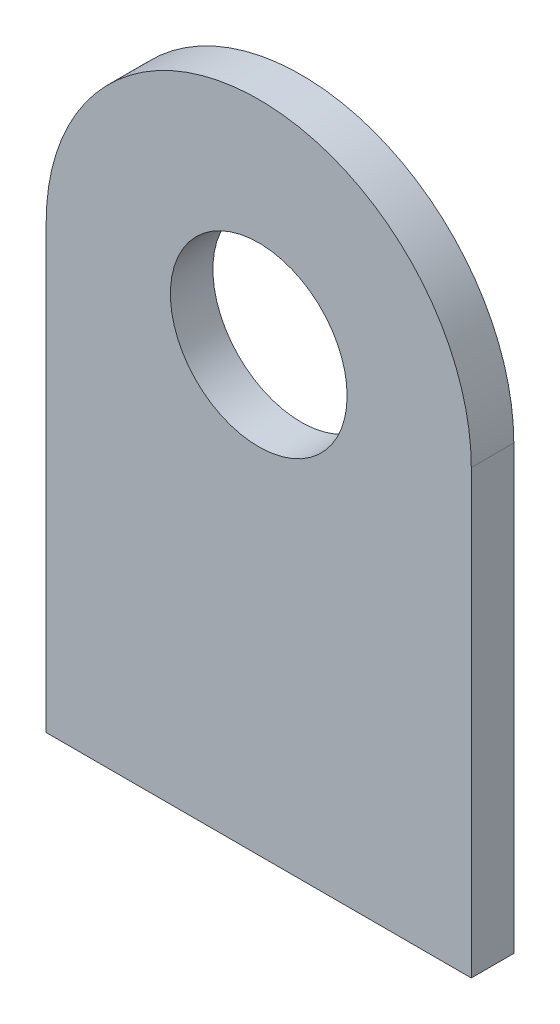
ISO-10303-21;
HEADER;
FILE_DESCRIPTION(('STEP AP214'),'2;1');
FILE_NAME('part.step','',(''),(''),'','','');
FILE_SCHEMA(('AUTOMOTIVE_DESIGN { 1 0 10303 214 1 1 1 1 }'));
ENDSEC;
DATA;
#1=APPLICATION_CONTEXT('core data for automotive mechanical design processes');
#2=APPLICATION_PROTOCOL_DEFINITION('international standard','automotive_design',2000,#1);
#3=PRODUCT_CONTEXT('',#1,'mechanical');
#4=PRODUCT('Part','Part','',(#3));
#5=PRODUCT_RELATED_PRODUCT_CATEGORY('part','',(#4));
#6=PRODUCT_DEFINITION_FORMATION('','',#4);
#7=PRODUCT_DEFINITION_CONTEXT('part definition',#1,'design');
#8=PRODUCT_DEFINITION('design','',#6,#7);
#9=PRODUCT_DEFINITION_SHAPE('','',#8);
#10=(LENGTH_UNIT() NAMED_UNIT(*) SI_UNIT(.MILLI.,.METRE.));
#11=(NAMED_UNIT(*) PLANE_ANGLE_UNIT() SI_UNIT($,.RADIAN.));
#12=(NAMED_UNIT(*) SI_UNIT($,.STERADIAN.) SOLID_ANGLE_UNIT());
#13=UNCERTAINTY_MEASURE_WITH_UNIT(LENGTH_MEASURE(1.E-05),#10,'distance_accuracy_value','');
#14=(GEOMETRIC_REPRESENTATION_CONTEXT(3) GLOBAL_UNCERTAINTY_ASSIGNED_CONTEXT((#13)) GLOBAL_UNIT_ASSIGNED_CONTEXT((#10,
#11,#12)) REPRESENTATION_CONTEXT('',''));
#15=CARTESIAN_POINT('',(0.,0.,0.));
#16=DIRECTION('',(0.,0.,1.));
#17=DIRECTION('',(1.,0.,0.));
#18=AXIS2_PLACEMENT_3D('',#15,#16,#17);
#19=CARTESIAN_POINT('',(0.,0.,1.5875));
#20=DIRECTION('',(0.,0.,-1.));
#21=DIRECTION('',(-1.,0.,0.));
#22=AXIS2_PLACEMENT_3D('',#19,#20,#21);
#23=CYLINDRICAL_SURFACE('',#22,7.9375);
#24=CARTESIAN_POINT('',(0.,0.,0.));
#25=DIRECTION('',(0.,0.,1.));
#26=DIRECTION('',(1.,0.,0.));
#27=AXIS2_PLACEMENT_3D('',#24,#25,#26);
#28=CIRCLE('',#27,7.9375);
#29=CARTESIAN_POINT('',(7.9375,0.,0.));
#30=VERTEX_POINT('',#29);
#31=CARTESIAN_POINT('',(-7.9375,0.,0.));
#32=VERTEX_POINT('',#31);
#33=EDGE_CURVE('E115',#30,#32,#28,.T.);
#34=ORIENTED_EDGE('',*,*,#33,.T.);
#35=DIRECTION('',(0.,0.,-1.));
#36=VECTOR('',#35,1.);
#37=CARTESIAN_POINT('',(-7.9375,0.,1.5875));
#38=LINE('',#37,#36);
#39=CARTESIAN_POINT('',(-7.9375,0.,1.5875));
#40=VERTEX_POINT('',#39);
#41=EDGE_CURVE('E11',#40,#32,#38,.T.);
#42=ORIENTED_EDGE('',*,*,#41,.F.);
#43=CARTESIAN_POINT('',(0.,0.,1.5875));
#44=DIRECTION('',(0.,0.,1.));
#45=DIRECTION('',(1.,0.,0.));
#46=AXIS2_PLACEMENT_3D('',#43,#44,#45);
#47=CIRCLE('',#46,7.9375);
#48=CARTESIAN_POINT('',(7.9375,0.,1.5875));
#49=VERTEX_POINT('',#48);
#50=EDGE_CURVE('E99',#49,#40,#47,.T.);
#51=ORIENTED_EDGE('',*,*,#50,.F.);
#52=DIRECTION('',(0.,0.,-1.));
#53=VECTOR('',#52,1.);
#54=CARTESIAN_POINT('',(7.9375,0.,1.5875));
#55=LINE('',#54,#53);
#56=EDGE_CURVE('E111',#49,#30,#55,.T.);
#57=ORIENTED_EDGE('',*,*,#56,.T.);
#58=EDGE_LOOP('',(#34,#42,#51,#57));
#59=FACE_BOUND('',#58,.T.);
#60=ADVANCED_FACE('F47',(#59),#23,.T.);
#61=CARTESIAN_POINT('',(-7.9375,0.,1.5875));
#62=DIRECTION('',(1.,0.,0.));
#63=DIRECTION('',(0.,1.,0.));
#64=AXIS2_PLACEMENT_3D('',#61,#62,#63);
#65=PLANE('',#64);
#66=DIRECTION('',(0.,-1.,0.));
#67=VECTOR('',#66,1.);
#68=CARTESIAN_POINT('',(-7.9375,0.,0.));
#69=LINE('',#68,#67);
#70=CARTESIAN_POINT('',(-7.9375,-16.51,0.));
#71=VERTEX_POINT('',#70);
#72=EDGE_CURVE('E104',#32,#71,#69,.T.);
#73=ORIENTED_EDGE('',*,*,#72,.T.);
#74=DIRECTION('',(0.,0.,-1.));
#75=VECTOR('',#74,1.);
#76=CARTESIAN_POINT('',(-7.9375,-16.51,1.5875));
#77=LINE('',#76,#75);
#78=CARTESIAN_POINT('',(-7.9375,-16.51,1.5875));
#79=VERTEX_POINT('',#78);
#80=EDGE_CURVE('E56',#79,#71,#77,.T.);
#81=ORIENTED_EDGE('',*,*,#80,.F.);
#82=DIRECTION('',(0.,-1.,0.));
#83=VECTOR('',#82,1.);
#84=CARTESIAN_POINT('',(-7.9375,0.,1.5875));
#85=LINE('',#84,#83);
#86=EDGE_CURVE('E94',#40,#79,#85,.T.);
#87=ORIENTED_EDGE('',*,*,#86,.F.);
#88=ORIENTED_EDGE('',*,*,#41,.T.);
#89=EDGE_LOOP('',(#73,#81,#87,#88));
#90=FACE_BOUND('',#89,.T.);
#91=ADVANCED_FACE('F103',(#90),#65,.F.);
#92=CARTESIAN_POINT('',(0.,-16.51,1.5875));
#93=DIRECTION('',(0.,1.,0.));
#94=DIRECTION('',(0.,0.,1.));
#95=AXIS2_PLACEMENT_3D('',#92,#93,#94);
#96=PLANE('',#95);
#97=DIRECTION('',(1.,0.,0.));
#98=VECTOR('',#97,1.);
#99=CARTESIAN_POINT('',(0.,-16.51,0.));
#100=LINE('',#99,#98);
#101=CARTESIAN_POINT('',(7.9375,-16.51,0.));
#102=VERTEX_POINT('',#101);
#103=EDGE_CURVE('E81',#71,#102,#100,.T.);
#104=ORIENTED_EDGE('',*,*,#103,.T.);
#105=DIRECTION('',(0.,0.,-1.));
#106=VECTOR('',#105,1.);
#107=CARTESIAN_POINT('',(7.9375,-16.51,1.5875));
#108=LINE('',#107,#106);
#109=CARTESIAN_POINT('',(7.9375,-16.51,1.5875));
#110=VERTEX_POINT('',#109);
#111=EDGE_CURVE('E106',#110,#102,#108,.T.);
#112=ORIENTED_EDGE('',*,*,#111,.F.);
#113=DIRECTION('',(1.,0.,0.));
#114=VECTOR('',#113,1.);
#115=CARTESIAN_POINT('',(0.,-16.51,1.5875));
#116=LINE('',#115,#114);
#117=EDGE_CURVE('E97',#79,#110,#116,.T.);
#118=ORIENTED_EDGE('',*,*,#117,.F.);
#119=ORIENTED_EDGE('',*,*,#80,.T.);
#120=EDGE_LOOP('',(#104,#112,#118,#119));
#121=FACE_BOUND('',#120,.T.);
#122=ADVANCED_FACE('F107',(#121),#96,.F.);
#123=CARTESIAN_POINT('',(7.9375,0.,1.5875));
#124=DIRECTION('',(-1.,0.,0.));
#125=DIRECTION('',(0.,-1.,0.));
#126=AXIS2_PLACEMENT_3D('',#123,#124,#125);
#127=PLANE('',#126);
#128=DIRECTION('',(0.,1.,0.));
#129=VECTOR('',#128,1.);
#130=CARTESIAN_POINT('',(7.9375,0.,0.));
#131=LINE('',#130,#129);
#132=EDGE_CURVE('E87',#102,#30,#131,.T.);
#133=ORIENTED_EDGE('',*,*,#132,.T.);
#134=ORIENTED_EDGE('',*,*,#56,.F.);
#135=DIRECTION('',(0.,1.,0.));
#136=VECTOR('',#135,1.);
#137=CARTESIAN_POINT('',(7.9375,0.,1.5875));
#138=LINE('',#137,#136);
#139=EDGE_CURVE('E64',#110,#49,#138,.T.);
#140=ORIENTED_EDGE('',*,*,#139,.F.);
#141=ORIENTED_EDGE('',*,*,#111,.T.);
#142=EDGE_LOOP('',(#133,#134,#140,#141));
#143=FACE_BOUND('',#142,.T.);
#144=ADVANCED_FACE('F129',(#143),#127,.F.);
#145=CARTESIAN_POINT('',(0.,0.,1.5875));
#146=DIRECTION('',(0.,0.,1.));
#147=DIRECTION('',(1.,0.,0.));
#148=AXIS2_PLACEMENT_3D('',#145,#146,#147);
#149=PLANE('',#148);
#150=CARTESIAN_POINT('',(0.,0.,1.5875));
#151=DIRECTION('',(0.,0.,1.));
#152=DIRECTION('',(1.,0.,0.));
#153=AXIS2_PLACEMENT_3D('',#150,#151,#152);
#154=CIRCLE('',#153,3.3);
#155=CARTESIAN_POINT('',(3.3,0.,1.5875));
#156=VERTEX_POINT('',#155);
#157=EDGE_CURVE('E139',#156,#156,#154,.T.);
#158=ORIENTED_EDGE('',*,*,#157,.F.);
#159=EDGE_LOOP('',(#158));
#160=FACE_BOUND('',#159,.T.);
#161=ORIENTED_EDGE('',*,*,#50,.T.);
#162=ORIENTED_EDGE('',*,*,#86,.T.);
#163=ORIENTED_EDGE('',*,*,#117,.T.);
#164=ORIENTED_EDGE('',*,*,#139,.T.);
#165=EDGE_LOOP('',(#161,#162,#163,#164));
#166=FACE_BOUND('',#165,.T.);
#167=ADVANCED_FACE('F95',(#160,#166),#149,.T.);
#168=CARTESIAN_POINT('',(0.,0.,0.));
#169=DIRECTION('',(0.,0.,1.));
#170=DIRECTION('',(1.,0.,0.));
#171=AXIS2_PLACEMENT_3D('',#168,#169,#170);
#172=PLANE('',#171);
#173=CARTESIAN_POINT('',(0.,0.,0.));
#174=DIRECTION('',(0.,0.,1.));
#175=DIRECTION('',(1.,0.,0.));
#176=AXIS2_PLACEMENT_3D('',#173,#174,#175);
#177=CIRCLE('',#176,3.3);
#178=CARTESIAN_POINT('',(3.3,0.,0.));
#179=VERTEX_POINT('',#178);
#180=EDGE_CURVE('E119',#179,#179,#177,.T.);
#181=ORIENTED_EDGE('',*,*,#180,.T.);
#182=EDGE_LOOP('',(#181));
#183=FACE_BOUND('',#182,.T.);
#184=ORIENTED_EDGE('',*,*,#33,.F.);
#185=ORIENTED_EDGE('',*,*,#132,.F.);
#186=ORIENTED_EDGE('',*,*,#103,.F.);
#187=ORIENTED_EDGE('',*,*,#72,.F.);
#188=EDGE_LOOP('',(#184,#185,#186,#187));
#189=FACE_BOUND('',#188,.T.);
#190=ADVANCED_FACE('F132',(#183,#189),#172,.F.);
#191=CARTESIAN_POINT('',(0.,0.,1.5875));
#192=DIRECTION('',(0.,0.,1.));
#193=DIRECTION('',(1.,0.,0.));
#194=AXIS2_PLACEMENT_3D('',#191,#192,#193);
#195=CYLINDRICAL_SURFACE('',#194,3.3);
#196=ORIENTED_EDGE('',*,*,#180,.F.);
#197=EDGE_LOOP('',(#196));
#198=FACE_BOUND('',#197,.T.);
#199=ORIENTED_EDGE('',*,*,#157,.T.);
#200=EDGE_LOOP('',(#199));
#201=FACE_BOUND('',#200,.T.);
#202=ADVANCED_FACE('F144',(#198,#201),#195,.F.);
#203=CLOSED_SHELL('',(#60,#91,#122,#144,#167,#190,#202));
#204=MANIFOLD_SOLID_BREP('B2',#203);
#205=ADVANCED_BREP_SHAPE_REPRESENTATION('',(#18,#204),#14);
#206=SHAPE_DEFINITION_REPRESENTATION(#9,#205);
ENDSEC;
END-ISO-10303-21;
